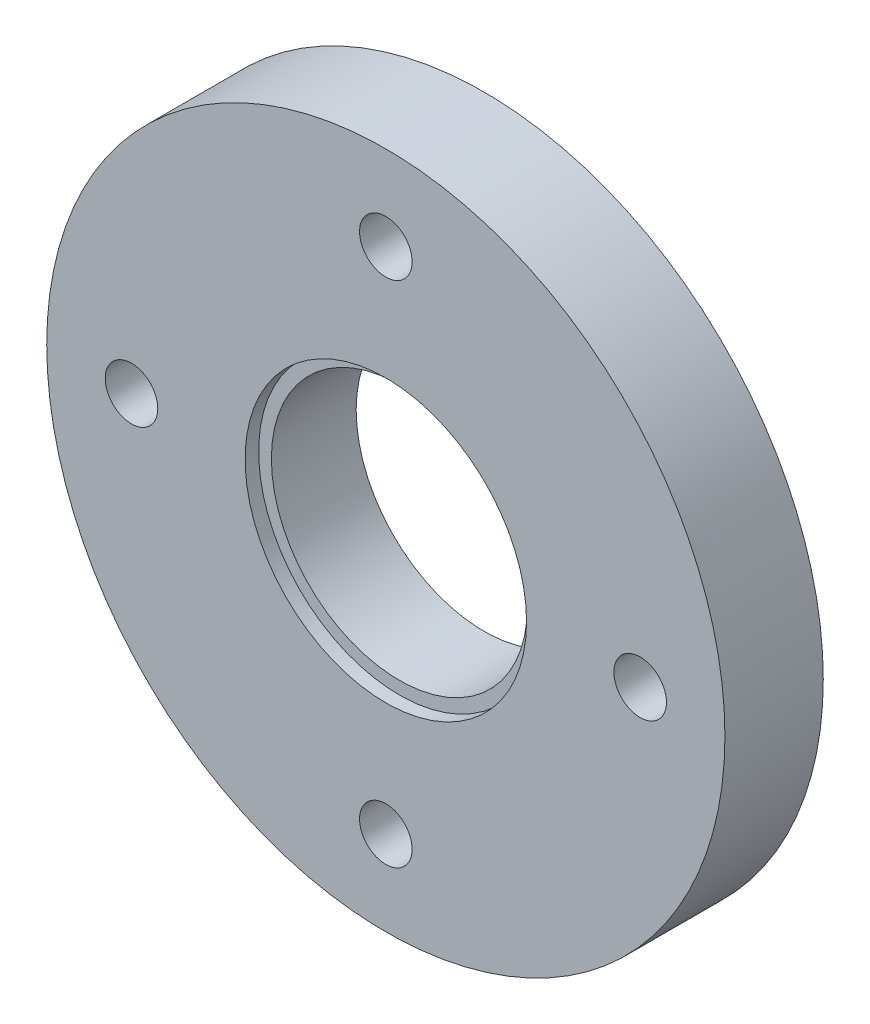
ISO-10303-21;
HEADER;
FILE_DESCRIPTION(('STEP AP214'),'2;1');
FILE_NAME('part.step','',(''),(''),'','','');
FILE_SCHEMA(('AUTOMOTIVE_DESIGN { 1 0 10303 214 1 1 1 1 }'));
ENDSEC;
DATA;
#1=APPLICATION_CONTEXT('core data for automotive mechanical design processes');
#2=APPLICATION_PROTOCOL_DEFINITION('international standard','automotive_design',2000,#1);
#3=PRODUCT_CONTEXT('',#1,'mechanical');
#4=PRODUCT('Part','Part','',(#3));
#5=PRODUCT_RELATED_PRODUCT_CATEGORY('part','',(#4));
#6=PRODUCT_DEFINITION_FORMATION('','',#4);
#7=PRODUCT_DEFINITION_CONTEXT('part definition',#1,'design');
#8=PRODUCT_DEFINITION('design','',#6,#7);
#9=PRODUCT_DEFINITION_SHAPE('','',#8);
#10=(LENGTH_UNIT() NAMED_UNIT(*) SI_UNIT(.MILLI.,.METRE.));
#11=(NAMED_UNIT(*) PLANE_ANGLE_UNIT() SI_UNIT($,.RADIAN.));
#12=(NAMED_UNIT(*) SI_UNIT($,.STERADIAN.) SOLID_ANGLE_UNIT());
#13=UNCERTAINTY_MEASURE_WITH_UNIT(LENGTH_MEASURE(1.E-05),#10,'distance_accuracy_value','');
#14=(GEOMETRIC_REPRESENTATION_CONTEXT(3) GLOBAL_UNCERTAINTY_ASSIGNED_CONTEXT((#13)) GLOBAL_UNIT_ASSIGNED_CONTEXT((#10,
#11,#12)) REPRESENTATION_CONTEXT('',''));
#15=CARTESIAN_POINT('',(0.,0.,0.));
#16=DIRECTION('',(0.,0.,1.));
#17=DIRECTION('',(1.,0.,0.));
#18=AXIS2_PLACEMENT_3D('',#15,#16,#17);
#19=CARTESIAN_POINT('',(0.,0.,5.8));
#20=DIRECTION('',(0.,0.,-1.));
#21=DIRECTION('',(-1.,0.,0.));
#22=AXIS2_PLACEMENT_3D('',#19,#20,#21);
#23=CYLINDRICAL_SURFACE('',#22,7.55);
#24=CARTESIAN_POINT('',(0.,0.,0.));
#25=DIRECTION('',(0.,0.,1.));
#26=DIRECTION('',(1.,0.,0.));
#27=AXIS2_PLACEMENT_3D('',#24,#25,#26);
#28=CIRCLE('',#27,7.55);
#29=CARTESIAN_POINT('',(7.55,0.,0.));
#30=VERTEX_POINT('',#29);
#31=EDGE_CURVE('E44',#30,#30,#28,.T.);
#32=ORIENTED_EDGE('',*,*,#31,.F.);
#33=EDGE_LOOP('',(#32));
#34=FACE_BOUND('',#33,.T.);
#35=CARTESIAN_POINT('',(0.,0.,5.));
#36=DIRECTION('',(0.,0.,1.));
#37=DIRECTION('',(1.,0.,0.));
#38=AXIS2_PLACEMENT_3D('',#35,#36,#37);
#39=CIRCLE('',#38,7.55);
#40=CARTESIAN_POINT('',(7.55,0.,5.));
#41=VERTEX_POINT('',#40);
#42=EDGE_CURVE('E35',#41,#41,#39,.T.);
#43=ORIENTED_EDGE('',*,*,#42,.T.);
#44=EDGE_LOOP('',(#43));
#45=FACE_BOUND('',#44,.T.);
#46=ADVANCED_FACE('F31',(#34,#45),#23,.F.);
#47=CARTESIAN_POINT('',(0.,0.,5.8));
#48=DIRECTION('',(0.,0.,1.));
#49=DIRECTION('',(1.,0.,0.));
#50=AXIS2_PLACEMENT_3D('',#47,#48,#49);
#51=PLANE('',#50);
#52=CARTESIAN_POINT('',(0.,0.,5.8));
#53=DIRECTION('',(0.,0.,1.));
#54=DIRECTION('',(1.,0.,0.));
#55=AXIS2_PLACEMENT_3D('',#52,#53,#54);
#56=CIRCLE('',#55,8.3);
#57=CARTESIAN_POINT('',(8.3,0.,5.8));
#58=VERTEX_POINT('',#57);
#59=EDGE_CURVE('E72',#58,#58,#56,.T.);
#60=ORIENTED_EDGE('',*,*,#59,.F.);
#61=EDGE_LOOP('',(#60));
#62=FACE_BOUND('',#61,.T.);
#63=CARTESIAN_POINT('',(0.,-15.,5.8));
#64=DIRECTION('',(0.,0.,1.));
#65=DIRECTION('',(1.,0.,0.));
#66=AXIS2_PLACEMENT_3D('',#63,#64,#65);
#67=CIRCLE('',#66,1.55);
#68=CARTESIAN_POINT('',(1.55,-15.,5.8));
#69=VERTEX_POINT('',#68);
#70=EDGE_CURVE('E58',#69,#69,#67,.T.);
#71=ORIENTED_EDGE('',*,*,#70,.F.);
#72=EDGE_LOOP('',(#71));
#73=FACE_BOUND('',#72,.T.);
#74=CARTESIAN_POINT('',(0.,15.,5.8));
#75=DIRECTION('',(0.,0.,1.));
#76=DIRECTION('',(1.,0.,0.));
#77=AXIS2_PLACEMENT_3D('',#74,#75,#76);
#78=CIRCLE('',#77,1.55);
#79=CARTESIAN_POINT('',(1.55,15.,5.8));
#80=VERTEX_POINT('',#79);
#81=EDGE_CURVE('E48',#80,#80,#78,.T.);
#82=ORIENTED_EDGE('',*,*,#81,.F.);
#83=EDGE_LOOP('',(#82));
#84=FACE_BOUND('',#83,.T.);
#85=CARTESIAN_POINT('',(0.,0.,5.8));
#86=DIRECTION('',(0.,0.,1.));
#87=DIRECTION('',(1.,0.,0.));
#88=AXIS2_PLACEMENT_3D('',#85,#86,#87);
#89=CIRCLE('',#88,20.);
#90=CARTESIAN_POINT('',(20.,0.,5.8));
#91=VERTEX_POINT('',#90);
#92=EDGE_CURVE('E10',#91,#91,#89,.T.);
#93=ORIENTED_EDGE('',*,*,#92,.T.);
#94=EDGE_LOOP('',(#93));
#95=FACE_BOUND('',#94,.T.);
#96=CARTESIAN_POINT('',(15.,0.,5.8));
#97=DIRECTION('',(0.,0.,1.));
#98=DIRECTION('',(1.,0.,0.));
#99=AXIS2_PLACEMENT_3D('',#96,#97,#98);
#100=CIRCLE('',#99,1.55);
#101=CARTESIAN_POINT('',(16.55,0.,5.8));
#102=VERTEX_POINT('',#101);
#103=EDGE_CURVE('E52',#102,#102,#100,.T.);
#104=ORIENTED_EDGE('',*,*,#103,.F.);
#105=EDGE_LOOP('',(#104));
#106=FACE_BOUND('',#105,.T.);
#107=CARTESIAN_POINT('',(-15.,0.,5.8));
#108=DIRECTION('',(0.,0.,1.));
#109=DIRECTION('',(1.,0.,0.));
#110=AXIS2_PLACEMENT_3D('',#107,#108,#109);
#111=CIRCLE('',#110,1.55);
#112=CARTESIAN_POINT('',(-13.45,0.,5.8));
#113=VERTEX_POINT('',#112);
#114=EDGE_CURVE('E64',#113,#113,#111,.T.);
#115=ORIENTED_EDGE('',*,*,#114,.F.);
#116=EDGE_LOOP('',(#115));
#117=FACE_BOUND('',#116,.T.);
#118=ADVANCED_FACE('F94',(#62,#73,#84,#95,#106,#117),#51,.T.);
#119=CARTESIAN_POINT('',(0.,0.,0.));
#120=DIRECTION('',(0.,0.,1.));
#121=DIRECTION('',(1.,0.,0.));
#122=AXIS2_PLACEMENT_3D('',#119,#120,#121);
#123=PLANE('',#122);
#124=CARTESIAN_POINT('',(0.,0.,0.));
#125=DIRECTION('',(0.,0.,1.));
#126=DIRECTION('',(1.,0.,0.));
#127=AXIS2_PLACEMENT_3D('',#124,#125,#126);
#128=CIRCLE('',#127,20.);
#129=CARTESIAN_POINT('',(20.,0.,0.));
#130=VERTEX_POINT('',#129);
#131=EDGE_CURVE('E39',#130,#130,#128,.T.);
#132=ORIENTED_EDGE('',*,*,#131,.F.);
#133=EDGE_LOOP('',(#132));
#134=FACE_BOUND('',#133,.T.);
#135=ORIENTED_EDGE('',*,*,#31,.T.);
#136=EDGE_LOOP('',(#135));
#137=FACE_BOUND('',#136,.T.);
#138=CARTESIAN_POINT('',(0.,15.,0.));
#139=DIRECTION('',(0.,0.,1.));
#140=DIRECTION('',(1.,0.,0.));
#141=AXIS2_PLACEMENT_3D('',#138,#139,#140);
#142=CIRCLE('',#141,1.55);
#143=CARTESIAN_POINT('',(1.55,15.,0.));
#144=VERTEX_POINT('',#143);
#145=EDGE_CURVE('E49',#144,#144,#142,.T.);
#146=ORIENTED_EDGE('',*,*,#145,.T.);
#147=EDGE_LOOP('',(#146));
#148=FACE_BOUND('',#147,.T.);
#149=CARTESIAN_POINT('',(15.,0.,0.));
#150=DIRECTION('',(0.,0.,1.));
#151=DIRECTION('',(1.,0.,0.));
#152=AXIS2_PLACEMENT_3D('',#149,#150,#151);
#153=CIRCLE('',#152,1.55);
#154=CARTESIAN_POINT('',(16.55,0.,0.));
#155=VERTEX_POINT('',#154);
#156=EDGE_CURVE('E55',#155,#155,#153,.T.);
#157=ORIENTED_EDGE('',*,*,#156,.T.);
#158=EDGE_LOOP('',(#157));
#159=FACE_BOUND('',#158,.T.);
#160=CARTESIAN_POINT('',(0.,-15.,0.));
#161=DIRECTION('',(0.,0.,1.));
#162=DIRECTION('',(1.,0.,0.));
#163=AXIS2_PLACEMENT_3D('',#160,#161,#162);
#164=CIRCLE('',#163,1.55);
#165=CARTESIAN_POINT('',(1.55,-15.,0.));
#166=VERTEX_POINT('',#165);
#167=EDGE_CURVE('E61',#166,#166,#164,.T.);
#168=ORIENTED_EDGE('',*,*,#167,.T.);
#169=EDGE_LOOP('',(#168));
#170=FACE_BOUND('',#169,.T.);
#171=CARTESIAN_POINT('',(-15.,0.,0.));
#172=DIRECTION('',(0.,0.,1.));
#173=DIRECTION('',(1.,0.,0.));
#174=AXIS2_PLACEMENT_3D('',#171,#172,#173);
#175=CIRCLE('',#174,1.55);
#176=CARTESIAN_POINT('',(-13.45,0.,0.));
#177=VERTEX_POINT('',#176);
#178=EDGE_CURVE('E67',#177,#177,#175,.T.);
#179=ORIENTED_EDGE('',*,*,#178,.T.);
#180=EDGE_LOOP('',(#179));
#181=FACE_BOUND('',#180,.T.);
#182=ADVANCED_FACE('F100',(#134,#137,#148,#159,#170,#181),#123,.F.);
#183=CARTESIAN_POINT('',(0.,0.,5.8));
#184=DIRECTION('',(0.,0.,-1.));
#185=DIRECTION('',(-1.,0.,0.));
#186=AXIS2_PLACEMENT_3D('',#183,#184,#185);
#187=CYLINDRICAL_SURFACE('',#186,20.);
#188=ORIENTED_EDGE('',*,*,#92,.F.);
#189=EDGE_LOOP('',(#188));
#190=FACE_BOUND('',#189,.T.);
#191=ORIENTED_EDGE('',*,*,#131,.T.);
#192=EDGE_LOOP('',(#191));
#193=FACE_BOUND('',#192,.T.);
#194=ADVANCED_FACE('F33',(#190,#193),#187,.T.);
#195=CARTESIAN_POINT('',(0.,15.,5.8));
#196=DIRECTION('',(0.,0.,-1.));
#197=DIRECTION('',(-1.,0.,0.));
#198=AXIS2_PLACEMENT_3D('',#195,#196,#197);
#199=CYLINDRICAL_SURFACE('',#198,1.55);
#200=ORIENTED_EDGE('',*,*,#81,.T.);
#201=EDGE_LOOP('',(#200));
#202=FACE_BOUND('',#201,.T.);
#203=ORIENTED_EDGE('',*,*,#145,.F.);
#204=EDGE_LOOP('',(#203));
#205=FACE_BOUND('',#204,.T.);
#206=ADVANCED_FACE('F105',(#202,#205),#199,.F.);
#207=CARTESIAN_POINT('',(15.,0.,5.8));
#208=DIRECTION('',(0.,0.,-1.));
#209=DIRECTION('',(-1.,0.,0.));
#210=AXIS2_PLACEMENT_3D('',#207,#208,#209);
#211=CYLINDRICAL_SURFACE('',#210,1.55);
#212=ORIENTED_EDGE('',*,*,#103,.T.);
#213=EDGE_LOOP('',(#212));
#214=FACE_BOUND('',#213,.T.);
#215=ORIENTED_EDGE('',*,*,#156,.F.);
#216=EDGE_LOOP('',(#215));
#217=FACE_BOUND('',#216,.T.);
#218=ADVANCED_FACE('F131',(#214,#217),#211,.F.);
#219=CARTESIAN_POINT('',(0.,-15.,5.8));
#220=DIRECTION('',(0.,0.,-1.));
#221=DIRECTION('',(-1.,0.,0.));
#222=AXIS2_PLACEMENT_3D('',#219,#220,#221);
#223=CYLINDRICAL_SURFACE('',#222,1.55);
#224=ORIENTED_EDGE('',*,*,#70,.T.);
#225=EDGE_LOOP('',(#224));
#226=FACE_BOUND('',#225,.T.);
#227=ORIENTED_EDGE('',*,*,#167,.F.);
#228=EDGE_LOOP('',(#227));
#229=FACE_BOUND('',#228,.T.);
#230=ADVANCED_FACE('F125',(#226,#229),#223,.F.);
#231=CARTESIAN_POINT('',(-15.,0.,5.8));
#232=DIRECTION('',(0.,0.,-1.));
#233=DIRECTION('',(-1.,0.,0.));
#234=AXIS2_PLACEMENT_3D('',#231,#232,#233);
#235=CYLINDRICAL_SURFACE('',#234,1.55);
#236=ORIENTED_EDGE('',*,*,#114,.T.);
#237=EDGE_LOOP('',(#236));
#238=FACE_BOUND('',#237,.T.);
#239=ORIENTED_EDGE('',*,*,#178,.F.);
#240=EDGE_LOOP('',(#239));
#241=FACE_BOUND('',#240,.T.);
#242=ADVANCED_FACE('F90',(#238,#241),#235,.F.);
#243=CARTESIAN_POINT('',(0.,0.,5.));
#244=DIRECTION('',(0.,0.,1.));
#245=DIRECTION('',(1.,0.,0.));
#246=AXIS2_PLACEMENT_3D('',#243,#244,#245);
#247=CYLINDRICAL_SURFACE('',#246,8.3);
#248=CARTESIAN_POINT('',(0.,0.,5.));
#249=DIRECTION('',(0.,0.,1.));
#250=DIRECTION('',(1.,0.,0.));
#251=AXIS2_PLACEMENT_3D('',#248,#249,#250);
#252=CIRCLE('',#251,8.3);
#253=CARTESIAN_POINT('',(8.3,0.,5.));
#254=VERTEX_POINT('',#253);
#255=EDGE_CURVE('E75',#254,#254,#252,.T.);
#256=ORIENTED_EDGE('',*,*,#255,.F.);
#257=EDGE_LOOP('',(#256));
#258=FACE_BOUND('',#257,.T.);
#259=ORIENTED_EDGE('',*,*,#59,.T.);
#260=EDGE_LOOP('',(#259));
#261=FACE_BOUND('',#260,.T.);
#262=ADVANCED_FACE('F85',(#258,#261),#247,.F.);
#263=CARTESIAN_POINT('',(0.,0.,5.));
#264=DIRECTION('',(0.,0.,1.));
#265=DIRECTION('',(1.,0.,0.));
#266=AXIS2_PLACEMENT_3D('',#263,#264,#265);
#267=PLANE('',#266);
#268=ORIENTED_EDGE('',*,*,#42,.F.);
#269=EDGE_LOOP('',(#268));
#270=FACE_BOUND('',#269,.T.);
#271=ORIENTED_EDGE('',*,*,#255,.T.);
#272=EDGE_LOOP('',(#271));
#273=FACE_BOUND('',#272,.T.);
#274=ADVANCED_FACE('F83',(#270,#273),#267,.T.);
#275=CLOSED_SHELL('',(#46,#118,#182,#194,#206,#218,#230,#242,#262,#274));
#276=MANIFOLD_SOLID_BREP('B2',#275);
#277=ADVANCED_BREP_SHAPE_REPRESENTATION('',(#18,#276),#14);
#278=SHAPE_DEFINITION_REPRESENTATION(#9,#277);
ENDSEC;
END-ISO-10303-21;
